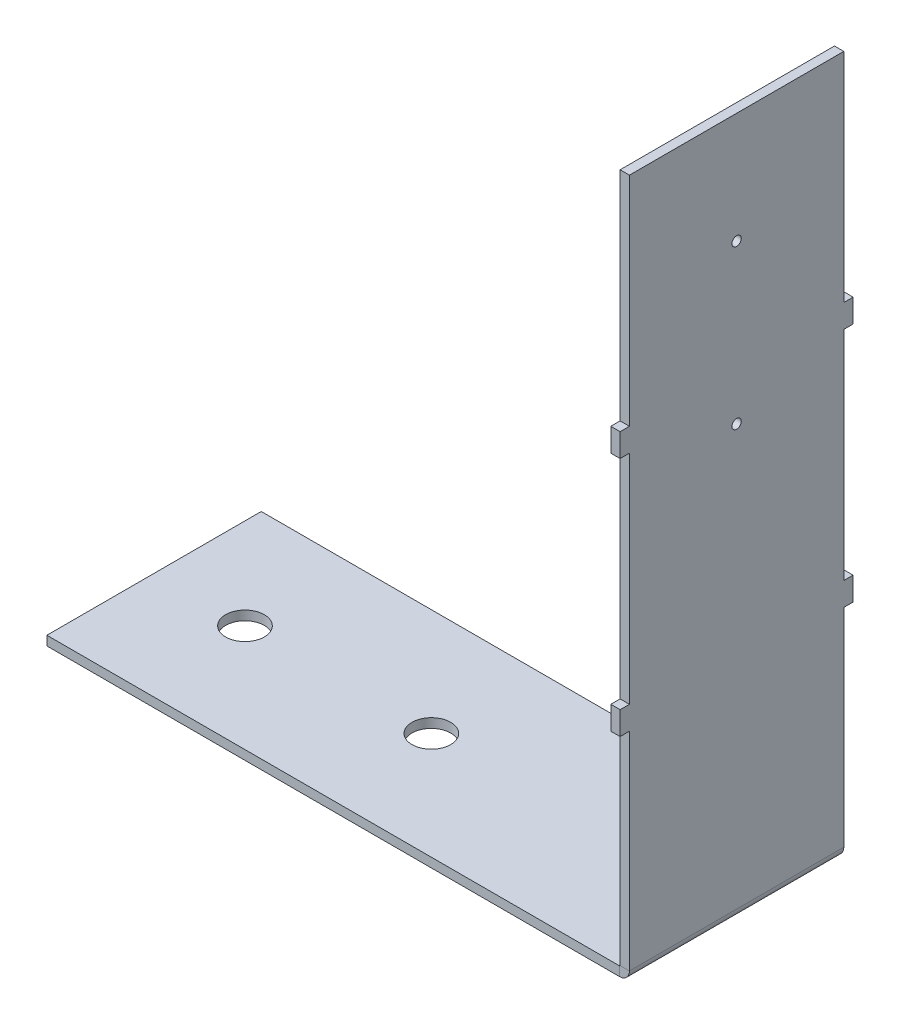
ISO-10303-21;
HEADER;
FILE_DESCRIPTION(('STEP AP214'),'2;1');
FILE_NAME('part.step','',(''),(''),'','','');
FILE_SCHEMA(('AUTOMOTIVE_DESIGN { 1 0 10303 214 1 1 1 1 }'));
ENDSEC;
DATA;
#1=APPLICATION_CONTEXT('core data for automotive mechanical design processes');
#2=APPLICATION_PROTOCOL_DEFINITION('international standard','automotive_design',2000,#1);
#3=PRODUCT_CONTEXT('',#1,'mechanical');
#4=PRODUCT('Part','Part','',(#3));
#5=PRODUCT_RELATED_PRODUCT_CATEGORY('part','',(#4));
#6=PRODUCT_DEFINITION_FORMATION('','',#4);
#7=PRODUCT_DEFINITION_CONTEXT('part definition',#1,'design');
#8=PRODUCT_DEFINITION('design','',#6,#7);
#9=PRODUCT_DEFINITION_SHAPE('','',#8);
#10=(LENGTH_UNIT() NAMED_UNIT(*) SI_UNIT(.MILLI.,.METRE.));
#11=(NAMED_UNIT(*) PLANE_ANGLE_UNIT() SI_UNIT($,.RADIAN.));
#12=(NAMED_UNIT(*) SI_UNIT($,.STERADIAN.) SOLID_ANGLE_UNIT());
#13=UNCERTAINTY_MEASURE_WITH_UNIT(LENGTH_MEASURE(1.E-05),#10,'distance_accuracy_value','');
#14=(GEOMETRIC_REPRESENTATION_CONTEXT(3) GLOBAL_UNCERTAINTY_ASSIGNED_CONTEXT((#13)) GLOBAL_UNIT_ASSIGNED_CONTEXT((#10,
#11,#12)) REPRESENTATION_CONTEXT('',''));
#15=CARTESIAN_POINT('',(0.,0.,0.));
#16=DIRECTION('',(0.,0.,1.));
#17=DIRECTION('',(1.,0.,0.));
#18=AXIS2_PLACEMENT_3D('',#15,#16,#17);
#19=CARTESIAN_POINT('',(642.5,94.9999999999999,145.));
#20=DIRECTION('',(0.,-1.,0.));
#21=DIRECTION('',(0.,0.,-1.));
#22=AXIS2_PLACEMENT_3D('',#19,#20,#21);
#23=CYLINDRICAL_SURFACE('',#22,4.15);
#24=CARTESIAN_POINT('',(642.5,94.9999999999999,145.));
#25=DIRECTION('',(0.,-1.,0.));
#26=DIRECTION('',(1.,0.,0.));
#27=AXIS2_PLACEMENT_3D('',#24,#25,#26);
#28=CIRCLE('',#27,4.15);
#29=CARTESIAN_POINT('',(646.65,94.9999999999999,145.));
#30=VERTEX_POINT('',#29);
#31=EDGE_CURVE('E253',#30,#30,#28,.T.);
#32=ORIENTED_EDGE('',*,*,#31,.T.);
#33=EDGE_LOOP('',(#32));
#34=FACE_BOUND('',#33,.T.);
#35=CARTESIAN_POINT('',(642.5,96.9999999999999,145.));
#36=DIRECTION('',(0.,1.,0.));
#37=DIRECTION('',(-1.,0.,0.));
#38=AXIS2_PLACEMENT_3D('',#35,#36,#37);
#39=CIRCLE('',#38,4.15);
#40=CARTESIAN_POINT('',(638.35,96.9999999999999,145.));
#41=VERTEX_POINT('',#40);
#42=EDGE_CURVE('E56',#41,#41,#39,.F.);
#43=ORIENTED_EDGE('',*,*,#42,.F.);
#44=EDGE_LOOP('',(#43));
#45=FACE_BOUND('',#44,.T.);
#46=ADVANCED_FACE('F45',(#34,#45),#23,.F.);
#47=CARTESIAN_POINT('',(682.5,94.9999999999999,145.));
#48=DIRECTION('',(0.,-1.,0.));
#49=DIRECTION('',(0.,0.,-1.));
#50=AXIS2_PLACEMENT_3D('',#47,#48,#49);
#51=CYLINDRICAL_SURFACE('',#50,4.15);
#52=CARTESIAN_POINT('',(682.5,94.9999999999999,145.));
#53=DIRECTION('',(0.,-1.,0.));
#54=DIRECTION('',(1.,0.,0.));
#55=AXIS2_PLACEMENT_3D('',#52,#53,#54);
#56=CIRCLE('',#55,4.15);
#57=CARTESIAN_POINT('',(686.65,94.9999999999999,145.));
#58=VERTEX_POINT('',#57);
#59=EDGE_CURVE('E515',#58,#58,#56,.T.);
#60=ORIENTED_EDGE('',*,*,#59,.T.);
#61=EDGE_LOOP('',(#60));
#62=FACE_BOUND('',#61,.T.);
#63=CARTESIAN_POINT('',(682.5,96.9999999999999,145.));
#64=DIRECTION('',(0.,1.,0.));
#65=DIRECTION('',(-1.,0.,0.));
#66=AXIS2_PLACEMENT_3D('',#63,#64,#65);
#67=CIRCLE('',#66,4.15);
#68=CARTESIAN_POINT('',(678.35,96.9999999999999,145.));
#69=VERTEX_POINT('',#68);
#70=EDGE_CURVE('E12',#69,#69,#67,.F.);
#71=ORIENTED_EDGE('',*,*,#70,.F.);
#72=EDGE_LOOP('',(#71));
#73=FACE_BOUND('',#72,.T.);
#74=ADVANCED_FACE('F474',(#62,#73),#51,.F.);
#75=CARTESIAN_POINT('',(623.,357.453119623296,120.));
#76=DIRECTION('',(1.,0.,0.));
#77=DIRECTION('',(0.,1.,0.));
#78=AXIS2_PLACEMENT_3D('',#75,#76,#77);
#79=PLANE('',#78);
#80=DIRECTION('',(0.,0.,1.));
#81=VECTOR('',#80,1.);
#82=CARTESIAN_POINT('',(623.,94.9999999999999,120.));
#83=LINE('',#82,#81);
#84=CARTESIAN_POINT('',(623.,95.,122.));
#85=VERTEX_POINT('',#84);
#86=CARTESIAN_POINT('',(623.,94.9999999999999,168.));
#87=VERTEX_POINT('',#86);
#88=EDGE_CURVE('E232',#85,#87,#83,.T.);
#89=ORIENTED_EDGE('',*,*,#88,.T.);
#90=DIRECTION('',(0.,-1.,0.));
#91=VECTOR('',#90,1.);
#92=CARTESIAN_POINT('',(623.,357.453119623296,168.));
#93=LINE('',#92,#91);
#94=CARTESIAN_POINT('',(623.,96.9999999999999,168.));
#95=VERTEX_POINT('',#94);
#96=EDGE_CURVE('E502',#95,#87,#93,.T.);
#97=ORIENTED_EDGE('',*,*,#96,.F.);
#98=DIRECTION('',(0.,0.,1.));
#99=VECTOR('',#98,1.);
#100=CARTESIAN_POINT('',(623.,96.9999999999999,120.));
#101=LINE('',#100,#99);
#102=CARTESIAN_POINT('',(623.,97.,122.));
#103=VERTEX_POINT('',#102);
#104=EDGE_CURVE('E91',#103,#95,#101,.T.);
#105=ORIENTED_EDGE('',*,*,#104,.F.);
#106=DIRECTION('',(0.,-1.,0.));
#107=VECTOR('',#106,1.);
#108=CARTESIAN_POINT('',(623.,357.453119623296,122.));
#109=LINE('',#108,#107);
#110=EDGE_CURVE('E243',#103,#85,#109,.T.);
#111=ORIENTED_EDGE('',*,*,#110,.T.);
#112=EDGE_LOOP('',(#89,#97,#105,#111));
#113=FACE_BOUND('',#112,.T.);
#114=ADVANCED_FACE('F480',(#113),#79,.F.);
#115=CARTESIAN_POINT('',(748.,357.453119623296,122.));
#116=DIRECTION('',(0.,0.,-1.));
#117=DIRECTION('',(0.,1.,0.));
#118=AXIS2_PLACEMENT_3D('',#115,#116,#117);
#119=PLANE('',#118);
#120=DIRECTION('',(0.,-1.,0.));
#121=VECTOR('',#120,1.);
#122=CARTESIAN_POINT('',(745.9,357.453119623296,122.));
#123=LINE('',#122,#121);
#124=CARTESIAN_POINT('',(745.9,97.,122.));
#125=VERTEX_POINT('',#124);
#126=CARTESIAN_POINT('',(745.9,95.,122.));
#127=VERTEX_POINT('',#126);
#128=EDGE_CURVE('E234',#125,#127,#123,.T.);
#129=ORIENTED_EDGE('',*,*,#128,.T.);
#130=DIRECTION('',(-1.,0.,0.));
#131=VECTOR('',#130,1.);
#132=CARTESIAN_POINT('',(748.,95.,122.));
#133=LINE('',#132,#131);
#134=EDGE_CURVE('E86',#127,#85,#133,.T.);
#135=ORIENTED_EDGE('',*,*,#134,.T.);
#136=ORIENTED_EDGE('',*,*,#110,.F.);
#137=DIRECTION('',(1.,0.,0.));
#138=VECTOR('',#137,1.);
#139=CARTESIAN_POINT('',(748.,97.,122.));
#140=LINE('',#139,#138);
#141=EDGE_CURVE('E233',#103,#125,#140,.T.);
#142=ORIENTED_EDGE('',*,*,#141,.T.);
#143=EDGE_LOOP('',(#129,#135,#136,#142));
#144=FACE_BOUND('',#143,.T.);
#145=ADVANCED_FACE('F237',(#144),#119,.T.);
#146=CARTESIAN_POINT('',(748.,95.,120.));
#147=DIRECTION('',(0.,-1.,0.));
#148=DIRECTION('',(1.,0.,0.));
#149=AXIS2_PLACEMENT_3D('',#146,#147,#148);
#150=PLANE('',#149);
#151=DIRECTION('',(0.,0.,-1.));
#152=VECTOR('',#151,1.);
#153=CARTESIAN_POINT('',(745.9,95.,122.));
#154=LINE('',#153,#152);
#155=CARTESIAN_POINT('',(745.9,95.,168.));
#156=VERTEX_POINT('',#155);
#157=EDGE_CURVE('E229',#156,#127,#154,.T.);
#158=ORIENTED_EDGE('',*,*,#157,.F.);
#159=DIRECTION('',(1.,0.,0.));
#160=VECTOR('',#159,1.);
#161=CARTESIAN_POINT('',(748.,95.,168.));
#162=LINE('',#161,#160);
#163=EDGE_CURVE('E500',#87,#156,#162,.T.);
#164=ORIENTED_EDGE('',*,*,#163,.F.);
#165=ORIENTED_EDGE('',*,*,#88,.F.);
#166=ORIENTED_EDGE('',*,*,#134,.F.);
#167=EDGE_LOOP('',(#158,#164,#165,#166));
#168=FACE_BOUND('',#167,.T.);
#169=ORIENTED_EDGE('',*,*,#59,.F.);
#170=EDGE_LOOP('',(#169));
#171=FACE_BOUND('',#170,.T.);
#172=ORIENTED_EDGE('',*,*,#31,.F.);
#173=EDGE_LOOP('',(#172));
#174=FACE_BOUND('',#173,.T.);
#175=ADVANCED_FACE('F225',(#168,#171,#174),#150,.T.);
#176=CARTESIAN_POINT('',(748.,357.453119623296,168.));
#177=DIRECTION('',(0.,0.,-1.));
#178=DIRECTION('',(0.,1.,0.));
#179=AXIS2_PLACEMENT_3D('',#176,#177,#178);
#180=PLANE('',#179);
#181=ORIENTED_EDGE('',*,*,#163,.T.);
#182=DIRECTION('',(0.,-1.,0.));
#183=VECTOR('',#182,1.);
#184=CARTESIAN_POINT('',(745.9,357.453119623296,168.));
#185=LINE('',#184,#183);
#186=CARTESIAN_POINT('',(745.9,97.,168.));
#187=VERTEX_POINT('',#186);
#188=EDGE_CURVE('E254',#187,#156,#185,.T.);
#189=ORIENTED_EDGE('',*,*,#188,.F.);
#190=DIRECTION('',(1.,0.,0.));
#191=VECTOR('',#190,1.);
#192=CARTESIAN_POINT('',(748.,97.,168.));
#193=LINE('',#192,#191);
#194=EDGE_CURVE('E65',#95,#187,#193,.T.);
#195=ORIENTED_EDGE('',*,*,#194,.F.);
#196=ORIENTED_EDGE('',*,*,#96,.T.);
#197=EDGE_LOOP('',(#181,#189,#195,#196));
#198=FACE_BOUND('',#197,.T.);
#199=ADVANCED_FACE('F494',(#198),#180,.F.);
#200=CARTESIAN_POINT('',(746.,97.,168.));
#201=DIRECTION('',(0.,1.,0.));
#202=DIRECTION('',(-1.,0.,0.));
#203=AXIS2_PLACEMENT_3D('',#200,#201,#202);
#204=PLANE('',#203);
#205=DIRECTION('',(0.,0.,1.));
#206=VECTOR('',#205,1.);
#207=CARTESIAN_POINT('',(745.9,97.,122.));
#208=LINE('',#207,#206);
#209=EDGE_CURVE('E49',#125,#187,#208,.T.);
#210=ORIENTED_EDGE('',*,*,#209,.F.);
#211=ORIENTED_EDGE('',*,*,#141,.F.);
#212=ORIENTED_EDGE('',*,*,#104,.T.);
#213=ORIENTED_EDGE('',*,*,#194,.T.);
#214=EDGE_LOOP('',(#210,#211,#212,#213));
#215=FACE_BOUND('',#214,.T.);
#216=ORIENTED_EDGE('',*,*,#42,.T.);
#217=EDGE_LOOP('',(#216));
#218=FACE_BOUND('',#217,.T.);
#219=ORIENTED_EDGE('',*,*,#70,.T.);
#220=EDGE_LOOP('',(#219));
#221=FACE_BOUND('',#220,.T.);
#222=ADVANCED_FACE('F47',(#215,#218,#221),#204,.T.);
#223=CARTESIAN_POINT('',(748.,245.,120.));
#224=DIRECTION('',(1.,0.,0.));
#225=DIRECTION('',(0.,1.,0.));
#226=AXIS2_PLACEMENT_3D('',#223,#224,#225);
#227=PLANE('',#226);
#228=CARTESIAN_POINT('',(748.,221.249998746621,145.));
#229=DIRECTION('',(1.,0.,0.));
#230=DIRECTION('',(0.,1.,0.));
#231=AXIS2_PLACEMENT_3D('',#228,#229,#230);
#232=CIRCLE('',#231,0.999999999999998);
#233=CARTESIAN_POINT('',(748.,222.249998746621,145.));
#234=VERTEX_POINT('',#233);
#235=EDGE_CURVE('E358',#234,#234,#232,.T.);
#236=ORIENTED_EDGE('',*,*,#235,.F.);
#237=EDGE_LOOP('',(#236));
#238=FACE_BOUND('',#237,.T.);
#239=CARTESIAN_POINT('',(748.,187.282181110447,145.));
#240=DIRECTION('',(1.,0.,0.));
#241=DIRECTION('',(0.,1.,0.));
#242=AXIS2_PLACEMENT_3D('',#239,#240,#241);
#243=CIRCLE('',#242,0.999999999999998);
#244=CARTESIAN_POINT('',(748.,188.282181110447,145.));
#245=VERTEX_POINT('',#244);
#246=EDGE_CURVE('E362',#245,#245,#243,.T.);
#247=ORIENTED_EDGE('',*,*,#246,.F.);
#248=EDGE_LOOP('',(#247));
#249=FACE_BOUND('',#248,.T.);
#250=DIRECTION('',(0.,1.,0.));
#251=VECTOR('',#250,1.);
#252=CARTESIAN_POINT('',(748.,245.,168.));
#253=LINE('',#252,#251);
#254=CARTESIAN_POINT('',(748.,97.0999999999997,168.));
#255=VERTEX_POINT('',#254);
#256=CARTESIAN_POINT('',(748.,141.666666666667,168.));
#257=VERTEX_POINT('',#256);
#258=EDGE_CURVE('E530',#255,#257,#253,.T.);
#259=ORIENTED_EDGE('',*,*,#258,.F.);
#260=DIRECTION('',(0.,0.,-1.));
#261=VECTOR('',#260,1.);
#262=CARTESIAN_POINT('',(748.,97.0999999999999,122.));
#263=LINE('',#262,#261);
#264=CARTESIAN_POINT('',(748.,97.0999999999999,122.));
#265=VERTEX_POINT('',#264);
#266=EDGE_CURVE('E281',#255,#265,#263,.T.);
#267=ORIENTED_EDGE('',*,*,#266,.T.);
#268=DIRECTION('',(0.,-1.,0.));
#269=VECTOR('',#268,1.);
#270=CARTESIAN_POINT('',(748.,245.,122.));
#271=LINE('',#270,#269);
#272=CARTESIAN_POINT('',(748.,141.666666666667,122.));
#273=VERTEX_POINT('',#272);
#274=EDGE_CURVE('E376',#273,#265,#271,.T.);
#275=ORIENTED_EDGE('',*,*,#274,.F.);
#276=DIRECTION('',(0.,0.,-1.));
#277=VECTOR('',#276,1.);
#278=CARTESIAN_POINT('',(748.,141.666666666667,122.));
#279=LINE('',#278,#277);
#280=CARTESIAN_POINT('',(748.,141.666666666667,120.));
#281=VERTEX_POINT('',#280);
#282=EDGE_CURVE('E627',#273,#281,#279,.T.);
#283=ORIENTED_EDGE('',*,*,#282,.T.);
#284=DIRECTION('',(0.,1.,0.));
#285=VECTOR('',#284,1.);
#286=CARTESIAN_POINT('',(748.,141.666666666667,120.));
#287=LINE('',#286,#285);
#288=CARTESIAN_POINT('',(748.,146.666666666667,120.));
#289=VERTEX_POINT('',#288);
#290=EDGE_CURVE('E629',#281,#289,#287,.T.);
#291=ORIENTED_EDGE('',*,*,#290,.T.);
#292=DIRECTION('',(0.,0.,1.));
#293=VECTOR('',#292,1.);
#294=CARTESIAN_POINT('',(748.,146.666666666667,122.));
#295=LINE('',#294,#293);
#296=CARTESIAN_POINT('',(748.,146.666666666667,122.));
#297=VERTEX_POINT('',#296);
#298=EDGE_CURVE('E395',#289,#297,#295,.T.);
#299=ORIENTED_EDGE('',*,*,#298,.T.);
#300=CARTESIAN_POINT('',(748.,193.333333333333,122.));
#301=VERTEX_POINT('',#300);
#302=EDGE_CURVE('E375',#301,#297,#271,.T.);
#303=ORIENTED_EDGE('',*,*,#302,.F.);
#304=DIRECTION('',(0.,0.,-1.));
#305=VECTOR('',#304,1.);
#306=CARTESIAN_POINT('',(748.,193.333333333333,122.));
#307=LINE('',#306,#305);
#308=CARTESIAN_POINT('',(748.,193.333333333333,120.));
#309=VERTEX_POINT('',#308);
#310=EDGE_CURVE('E392',#301,#309,#307,.T.);
#311=ORIENTED_EDGE('',*,*,#310,.T.);
#312=DIRECTION('',(0.,1.,0.));
#313=VECTOR('',#312,1.);
#314=CARTESIAN_POINT('',(748.,193.333333333333,120.));
#315=LINE('',#314,#313);
#316=CARTESIAN_POINT('',(748.,198.333333333333,120.));
#317=VERTEX_POINT('',#316);
#318=EDGE_CURVE('E394',#309,#317,#315,.T.);
#319=ORIENTED_EDGE('',*,*,#318,.T.);
#320=DIRECTION('',(0.,0.,1.));
#321=VECTOR('',#320,1.);
#322=CARTESIAN_POINT('',(748.,198.333333333333,122.));
#323=LINE('',#322,#321);
#324=CARTESIAN_POINT('',(748.,198.333333333333,122.));
#325=VERTEX_POINT('',#324);
#326=EDGE_CURVE('E282',#317,#325,#323,.T.);
#327=ORIENTED_EDGE('',*,*,#326,.T.);
#328=CARTESIAN_POINT('',(748.,245.,122.));
#329=VERTEX_POINT('',#328);
#330=EDGE_CURVE('E370',#329,#325,#271,.T.);
#331=ORIENTED_EDGE('',*,*,#330,.F.);
#332=DIRECTION('',(0.,0.,1.));
#333=VECTOR('',#332,1.);
#334=CARTESIAN_POINT('',(748.,245.,120.));
#335=LINE('',#334,#333);
#336=CARTESIAN_POINT('',(748.,245.,168.));
#337=VERTEX_POINT('',#336);
#338=EDGE_CURVE('E374',#329,#337,#335,.T.);
#339=ORIENTED_EDGE('',*,*,#338,.T.);
#340=CARTESIAN_POINT('',(748.,198.333333333333,168.));
#341=VERTEX_POINT('',#340);
#342=EDGE_CURVE('E533',#341,#337,#253,.T.);
#343=ORIENTED_EDGE('',*,*,#342,.F.);
#344=DIRECTION('',(0.,0.,1.));
#345=VECTOR('',#344,1.);
#346=CARTESIAN_POINT('',(748.,198.333333333333,168.));
#347=LINE('',#346,#345);
#348=CARTESIAN_POINT('',(748.,198.333333333333,170.));
#349=VERTEX_POINT('',#348);
#350=EDGE_CURVE('E599',#341,#349,#347,.T.);
#351=ORIENTED_EDGE('',*,*,#350,.T.);
#352=DIRECTION('',(0.,-1.,0.));
#353=VECTOR('',#352,1.);
#354=CARTESIAN_POINT('',(748.,198.333333333333,170.));
#355=LINE('',#354,#353);
#356=CARTESIAN_POINT('',(748.,193.333333333333,170.));
#357=VERTEX_POINT('',#356);
#358=EDGE_CURVE('E601',#349,#357,#355,.T.);
#359=ORIENTED_EDGE('',*,*,#358,.T.);
#360=DIRECTION('',(0.,0.,-1.));
#361=VECTOR('',#360,1.);
#362=CARTESIAN_POINT('',(748.,193.333333333333,168.));
#363=LINE('',#362,#361);
#364=CARTESIAN_POINT('',(748.,193.333333333333,168.));
#365=VERTEX_POINT('',#364);
#366=EDGE_CURVE('E603',#357,#365,#363,.T.);
#367=ORIENTED_EDGE('',*,*,#366,.T.);
#368=CARTESIAN_POINT('',(748.,146.666666666667,168.));
#369=VERTEX_POINT('',#368);
#370=EDGE_CURVE('E532',#369,#365,#253,.T.);
#371=ORIENTED_EDGE('',*,*,#370,.F.);
#372=DIRECTION('',(0.,0.,1.));
#373=VECTOR('',#372,1.);
#374=CARTESIAN_POINT('',(748.,146.666666666667,168.));
#375=LINE('',#374,#373);
#376=CARTESIAN_POINT('',(748.,146.666666666667,170.));
#377=VERTEX_POINT('',#376);
#378=EDGE_CURVE('E618',#369,#377,#375,.T.);
#379=ORIENTED_EDGE('',*,*,#378,.T.);
#380=DIRECTION('',(0.,-1.,0.));
#381=VECTOR('',#380,1.);
#382=CARTESIAN_POINT('',(748.,146.666666666667,170.));
#383=LINE('',#382,#381);
#384=CARTESIAN_POINT('',(748.,141.666666666667,170.));
#385=VERTEX_POINT('',#384);
#386=EDGE_CURVE('E535',#377,#385,#383,.T.);
#387=ORIENTED_EDGE('',*,*,#386,.T.);
#388=DIRECTION('',(0.,0.,-1.));
#389=VECTOR('',#388,1.);
#390=CARTESIAN_POINT('',(748.,141.666666666667,168.));
#391=LINE('',#390,#389);
#392=EDGE_CURVE('E531',#385,#257,#391,.T.);
#393=ORIENTED_EDGE('',*,*,#392,.T.);
#394=EDGE_LOOP('',(#259,#267,#275,#283,#291,#299,#303,#311,#319,#327,#331,#339,#343,#351,#359,
#367,#371,#379,#387,#393));
#395=FACE_BOUND('',#394,.T.);
#396=ADVANCED_FACE('F402',(#238,#249,#395),#227,.T.);
#397=CARTESIAN_POINT('',(746.,245.,120.));
#398=DIRECTION('',(1.,0.,0.));
#399=DIRECTION('',(0.,1.,0.));
#400=AXIS2_PLACEMENT_3D('',#397,#398,#399);
#401=PLANE('',#400);
#402=CARTESIAN_POINT('',(746.,187.282181110447,145.));
#403=DIRECTION('',(-1.,0.,0.));
#404=DIRECTION('',(0.,-1.,0.));
#405=AXIS2_PLACEMENT_3D('',#402,#403,#404);
#406=CIRCLE('',#405,0.999999999999998);
#407=CARTESIAN_POINT('',(746.,186.282181110447,145.));
#408=VERTEX_POINT('',#407);
#409=EDGE_CURVE('E563',#408,#408,#406,.T.);
#410=ORIENTED_EDGE('',*,*,#409,.F.);
#411=EDGE_LOOP('',(#410));
#412=FACE_BOUND('',#411,.T.);
#413=CARTESIAN_POINT('',(746.,221.249998746621,145.));
#414=DIRECTION('',(-1.,0.,0.));
#415=DIRECTION('',(0.,-1.,0.));
#416=AXIS2_PLACEMENT_3D('',#413,#414,#415);
#417=CIRCLE('',#416,0.999999999999998);
#418=CARTESIAN_POINT('',(746.,220.249998746621,145.));
#419=VERTEX_POINT('',#418);
#420=EDGE_CURVE('E262',#419,#419,#417,.T.);
#421=ORIENTED_EDGE('',*,*,#420,.F.);
#422=EDGE_LOOP('',(#421));
#423=FACE_BOUND('',#422,.T.);
#424=DIRECTION('',(0.,0.,-1.));
#425=VECTOR('',#424,1.);
#426=CARTESIAN_POINT('',(746.,97.0999999999999,122.));
#427=LINE('',#426,#425);
#428=CARTESIAN_POINT('',(746.,97.0999999999999,168.));
#429=VERTEX_POINT('',#428);
#430=CARTESIAN_POINT('',(746.,97.1,122.));
#431=VERTEX_POINT('',#430);
#432=EDGE_CURVE('E276',#429,#431,#427,.T.);
#433=ORIENTED_EDGE('',*,*,#432,.F.);
#434=DIRECTION('',(0.,1.,0.));
#435=VECTOR('',#434,1.);
#436=CARTESIAN_POINT('',(746.,245.,168.));
#437=LINE('',#436,#435);
#438=CARTESIAN_POINT('',(746.,141.666666666667,168.));
#439=VERTEX_POINT('',#438);
#440=EDGE_CURVE('E98',#429,#439,#437,.T.);
#441=ORIENTED_EDGE('',*,*,#440,.T.);
#442=DIRECTION('',(0.,0.,-1.));
#443=VECTOR('',#442,1.);
#444=CARTESIAN_POINT('',(746.,141.666666666667,168.));
#445=LINE('',#444,#443);
#446=CARTESIAN_POINT('',(746.,141.666666666667,170.));
#447=VERTEX_POINT('',#446);
#448=EDGE_CURVE('E106',#447,#439,#445,.T.);
#449=ORIENTED_EDGE('',*,*,#448,.F.);
#450=DIRECTION('',(0.,-1.,0.));
#451=VECTOR('',#450,1.);
#452=CARTESIAN_POINT('',(746.,146.666666666667,170.));
#453=LINE('',#452,#451);
#454=CARTESIAN_POINT('',(746.,146.666666666667,170.));
#455=VERTEX_POINT('',#454);
#456=EDGE_CURVE('E542',#455,#447,#453,.T.);
#457=ORIENTED_EDGE('',*,*,#456,.F.);
#458=DIRECTION('',(0.,0.,1.));
#459=VECTOR('',#458,1.);
#460=CARTESIAN_POINT('',(746.,146.666666666667,168.));
#461=LINE('',#460,#459);
#462=CARTESIAN_POINT('',(746.,146.666666666667,168.));
#463=VERTEX_POINT('',#462);
#464=EDGE_CURVE('E544',#463,#455,#461,.T.);
#465=ORIENTED_EDGE('',*,*,#464,.F.);
#466=CARTESIAN_POINT('',(746.,193.333333333333,168.));
#467=VERTEX_POINT('',#466);
#468=EDGE_CURVE('E546',#463,#467,#437,.T.);
#469=ORIENTED_EDGE('',*,*,#468,.T.);
#470=DIRECTION('',(0.,0.,-1.));
#471=VECTOR('',#470,1.);
#472=CARTESIAN_POINT('',(746.,193.333333333333,168.));
#473=LINE('',#472,#471);
#474=CARTESIAN_POINT('',(746.,193.333333333333,170.));
#475=VERTEX_POINT('',#474);
#476=EDGE_CURVE('E579',#475,#467,#473,.T.);
#477=ORIENTED_EDGE('',*,*,#476,.F.);
#478=DIRECTION('',(0.,-1.,0.));
#479=VECTOR('',#478,1.);
#480=CARTESIAN_POINT('',(746.,198.333333333333,170.));
#481=LINE('',#480,#479);
#482=CARTESIAN_POINT('',(746.,198.333333333333,170.));
#483=VERTEX_POINT('',#482);
#484=EDGE_CURVE('E577',#483,#475,#481,.T.);
#485=ORIENTED_EDGE('',*,*,#484,.F.);
#486=DIRECTION('',(0.,0.,1.));
#487=VECTOR('',#486,1.);
#488=CARTESIAN_POINT('',(746.,198.333333333333,168.));
#489=LINE('',#488,#487);
#490=CARTESIAN_POINT('',(746.,198.333333333333,168.));
#491=VERTEX_POINT('',#490);
#492=EDGE_CURVE('E574',#491,#483,#489,.T.);
#493=ORIENTED_EDGE('',*,*,#492,.F.);
#494=CARTESIAN_POINT('',(746.,245.,168.));
#495=VERTEX_POINT('',#494);
#496=EDGE_CURVE('E564',#491,#495,#437,.T.);
#497=ORIENTED_EDGE('',*,*,#496,.T.);
#498=DIRECTION('',(0.,0.,1.));
#499=VECTOR('',#498,1.);
#500=CARTESIAN_POINT('',(746.,245.,120.));
#501=LINE('',#500,#499);
#502=CARTESIAN_POINT('',(746.,245.,122.));
#503=VERTEX_POINT('',#502);
#504=EDGE_CURVE('E421',#503,#495,#501,.T.);
#505=ORIENTED_EDGE('',*,*,#504,.F.);
#506=DIRECTION('',(0.,1.,0.));
#507=VECTOR('',#506,1.);
#508=CARTESIAN_POINT('',(746.,245.,122.));
#509=LINE('',#508,#507);
#510=CARTESIAN_POINT('',(746.,198.333333333333,122.));
#511=VERTEX_POINT('',#510);
#512=EDGE_CURVE('E417',#511,#503,#509,.T.);
#513=ORIENTED_EDGE('',*,*,#512,.F.);
#514=DIRECTION('',(0.,0.,1.));
#515=VECTOR('',#514,1.);
#516=CARTESIAN_POINT('',(746.,198.333333333333,122.));
#517=LINE('',#516,#515);
#518=CARTESIAN_POINT('',(746.,198.333333333333,120.));
#519=VERTEX_POINT('',#518);
#520=EDGE_CURVE('E413',#519,#511,#517,.T.);
#521=ORIENTED_EDGE('',*,*,#520,.F.);
#522=DIRECTION('',(0.,1.,0.));
#523=VECTOR('',#522,1.);
#524=CARTESIAN_POINT('',(746.,193.333333333333,120.));
#525=LINE('',#524,#523);
#526=CARTESIAN_POINT('',(746.,193.333333333333,120.));
#527=VERTEX_POINT('',#526);
#528=EDGE_CURVE('E416',#527,#519,#525,.T.);
#529=ORIENTED_EDGE('',*,*,#528,.F.);
#530=DIRECTION('',(0.,0.,-1.));
#531=VECTOR('',#530,1.);
#532=CARTESIAN_POINT('',(746.,193.333333333333,122.));
#533=LINE('',#532,#531);
#534=CARTESIAN_POINT('',(746.,193.333333333333,122.));
#535=VERTEX_POINT('',#534);
#536=EDGE_CURVE('E419',#535,#527,#533,.T.);
#537=ORIENTED_EDGE('',*,*,#536,.F.);
#538=CARTESIAN_POINT('',(746.,146.666666666667,122.));
#539=VERTEX_POINT('',#538);
#540=EDGE_CURVE('E422',#539,#535,#509,.T.);
#541=ORIENTED_EDGE('',*,*,#540,.F.);
#542=DIRECTION('',(0.,0.,1.));
#543=VECTOR('',#542,1.);
#544=CARTESIAN_POINT('',(746.,146.666666666667,122.));
#545=LINE('',#544,#543);
#546=CARTESIAN_POINT('',(746.,146.666666666667,120.));
#547=VERTEX_POINT('',#546);
#548=EDGE_CURVE('E437',#547,#539,#545,.T.);
#549=ORIENTED_EDGE('',*,*,#548,.F.);
#550=DIRECTION('',(0.,1.,0.));
#551=VECTOR('',#550,1.);
#552=CARTESIAN_POINT('',(746.,141.666666666667,120.));
#553=LINE('',#552,#551);
#554=CARTESIAN_POINT('',(746.,141.666666666667,120.));
#555=VERTEX_POINT('',#554);
#556=EDGE_CURVE('E439',#555,#547,#553,.T.);
#557=ORIENTED_EDGE('',*,*,#556,.F.);
#558=DIRECTION('',(0.,0.,-1.));
#559=VECTOR('',#558,1.);
#560=CARTESIAN_POINT('',(746.,141.666666666667,122.));
#561=LINE('',#560,#559);
#562=CARTESIAN_POINT('',(746.,141.666666666667,122.));
#563=VERTEX_POINT('',#562);
#564=EDGE_CURVE('E364',#563,#555,#561,.T.);
#565=ORIENTED_EDGE('',*,*,#564,.F.);
#566=EDGE_CURVE('E363',#431,#563,#509,.T.);
#567=ORIENTED_EDGE('',*,*,#566,.F.);
#568=EDGE_LOOP('',(#433,#441,#449,#457,#465,#469,#477,#485,#493,#497,#505,#513,#521,#529,#537,
#541,#549,#557,#565,#567));
#569=FACE_BOUND('',#568,.T.);
#570=ADVANCED_FACE('F462',(#412,#423,#569),#401,.F.);
#571=CARTESIAN_POINT('',(756.,187.282181110447,145.));
#572=DIRECTION('',(-1.,0.,0.));
#573=DIRECTION('',(0.,-1.,0.));
#574=AXIS2_PLACEMENT_3D('',#571,#572,#573);
#575=CYLINDRICAL_SURFACE('',#574,0.999999999999998);
#576=ORIENTED_EDGE('',*,*,#246,.T.);
#577=EDGE_LOOP('',(#576));
#578=FACE_BOUND('',#577,.T.);
#579=ORIENTED_EDGE('',*,*,#409,.T.);
#580=EDGE_LOOP('',(#579));
#581=FACE_BOUND('',#580,.T.);
#582=ADVANCED_FACE('F656',(#578,#581),#575,.F.);
#583=CARTESIAN_POINT('',(756.,221.249998746621,145.));
#584=DIRECTION('',(-1.,0.,0.));
#585=DIRECTION('',(0.,-1.,0.));
#586=AXIS2_PLACEMENT_3D('',#583,#584,#585);
#587=CYLINDRICAL_SURFACE('',#586,0.999999999999998);
#588=ORIENTED_EDGE('',*,*,#235,.T.);
#589=EDGE_LOOP('',(#588));
#590=FACE_BOUND('',#589,.T.);
#591=ORIENTED_EDGE('',*,*,#420,.T.);
#592=EDGE_LOOP('',(#591));
#593=FACE_BOUND('',#592,.T.);
#594=ADVANCED_FACE('F649',(#590,#593),#587,.F.);
#595=CARTESIAN_POINT('',(435.753879127378,245.,122.));
#596=DIRECTION('',(0.,0.,-1.));
#597=DIRECTION('',(-1.,0.,0.));
#598=AXIS2_PLACEMENT_3D('',#595,#596,#597);
#599=PLANE('',#598);
#600=DIRECTION('',(1.,0.,0.));
#601=VECTOR('',#600,1.);
#602=CARTESIAN_POINT('',(435.753879127378,141.666666666667,122.));
#603=LINE('',#602,#601);
#604=EDGE_CURVE('E288',#563,#273,#603,.T.);
#605=ORIENTED_EDGE('',*,*,#604,.T.);
#606=ORIENTED_EDGE('',*,*,#274,.T.);
#607=DIRECTION('',(1.,0.,0.));
#608=VECTOR('',#607,1.);
#609=CARTESIAN_POINT('',(435.753879127378,97.1000000000002,122.));
#610=LINE('',#609,#608);
#611=EDGE_CURVE('E259',#431,#265,#610,.T.);
#612=ORIENTED_EDGE('',*,*,#611,.F.);
#613=ORIENTED_EDGE('',*,*,#566,.T.);
#614=EDGE_LOOP('',(#605,#606,#612,#613));
#615=FACE_BOUND('',#614,.T.);
#616=ADVANCED_FACE('F633',(#615),#599,.T.);
#617=CARTESIAN_POINT('',(435.753879127378,245.,168.));
#618=DIRECTION('',(0.,0.,-1.));
#619=DIRECTION('',(-1.,0.,0.));
#620=AXIS2_PLACEMENT_3D('',#617,#618,#619);
#621=PLANE('',#620);
#622=ORIENTED_EDGE('',*,*,#258,.T.);
#623=DIRECTION('',(1.,0.,0.));
#624=VECTOR('',#623,1.);
#625=CARTESIAN_POINT('',(435.753879127378,141.666666666667,168.));
#626=LINE('',#625,#624);
#627=EDGE_CURVE('E339',#439,#257,#626,.T.);
#628=ORIENTED_EDGE('',*,*,#627,.F.);
#629=ORIENTED_EDGE('',*,*,#440,.F.);
#630=DIRECTION('',(1.,0.,0.));
#631=VECTOR('',#630,1.);
#632=CARTESIAN_POINT('',(435.753879127378,97.1000000000002,168.));
#633=LINE('',#632,#631);
#634=EDGE_CURVE('E341',#429,#255,#633,.T.);
#635=ORIENTED_EDGE('',*,*,#634,.T.);
#636=EDGE_LOOP('',(#622,#628,#629,#635));
#637=FACE_BOUND('',#636,.T.);
#638=ADVANCED_FACE('F529',(#637),#621,.F.);
#639=CARTESIAN_POINT('',(435.753879127378,141.666666666667,168.));
#640=DIRECTION('',(0.,-1.,0.));
#641=DIRECTION('',(1.,0.,0.));
#642=AXIS2_PLACEMENT_3D('',#639,#640,#641);
#643=PLANE('',#642);
#644=ORIENTED_EDGE('',*,*,#627,.T.);
#645=ORIENTED_EDGE('',*,*,#392,.F.);
#646=DIRECTION('',(1.,0.,0.));
#647=VECTOR('',#646,1.);
#648=CARTESIAN_POINT('',(435.753879127378,141.666666666667,170.));
#649=LINE('',#648,#647);
#650=EDGE_CURVE('E336',#447,#385,#649,.T.);
#651=ORIENTED_EDGE('',*,*,#650,.F.);
#652=ORIENTED_EDGE('',*,*,#448,.T.);
#653=EDGE_LOOP('',(#644,#645,#651,#652));
#654=FACE_BOUND('',#653,.T.);
#655=ADVANCED_FACE('F486',(#654),#643,.T.);
#656=CARTESIAN_POINT('',(435.753879127378,146.666666666667,170.));
#657=DIRECTION('',(0.,0.,1.));
#658=DIRECTION('',(1.,0.,0.));
#659=AXIS2_PLACEMENT_3D('',#656,#657,#658);
#660=PLANE('',#659);
#661=ORIENTED_EDGE('',*,*,#650,.T.);
#662=ORIENTED_EDGE('',*,*,#386,.F.);
#663=DIRECTION('',(1.,0.,0.));
#664=VECTOR('',#663,1.);
#665=CARTESIAN_POINT('',(435.753879127378,146.666666666667,170.));
#666=LINE('',#665,#664);
#667=EDGE_CURVE('E333',#455,#377,#666,.T.);
#668=ORIENTED_EDGE('',*,*,#667,.F.);
#669=ORIENTED_EDGE('',*,*,#456,.T.);
#670=EDGE_LOOP('',(#661,#662,#668,#669));
#671=FACE_BOUND('',#670,.T.);
#672=ADVANCED_FACE('F539',(#671),#660,.T.);
#673=CARTESIAN_POINT('',(435.753879127378,146.666666666667,168.));
#674=DIRECTION('',(0.,1.,0.));
#675=DIRECTION('',(-1.,0.,0.));
#676=AXIS2_PLACEMENT_3D('',#673,#674,#675);
#677=PLANE('',#676);
#678=ORIENTED_EDGE('',*,*,#667,.T.);
#679=ORIENTED_EDGE('',*,*,#378,.F.);
#680=DIRECTION('',(1.,0.,0.));
#681=VECTOR('',#680,1.);
#682=CARTESIAN_POINT('',(435.753879127378,146.666666666667,168.));
#683=LINE('',#682,#681);
#684=EDGE_CURVE('E330',#463,#369,#683,.T.);
#685=ORIENTED_EDGE('',*,*,#684,.F.);
#686=ORIENTED_EDGE('',*,*,#464,.T.);
#687=EDGE_LOOP('',(#678,#679,#685,#686));
#688=FACE_BOUND('',#687,.T.);
#689=ADVANCED_FACE('F679',(#688),#677,.T.);
#690=ORIENTED_EDGE('',*,*,#370,.T.);
#691=DIRECTION('',(1.,0.,0.));
#692=VECTOR('',#691,1.);
#693=CARTESIAN_POINT('',(435.753879127378,193.333333333334,168.));
#694=LINE('',#693,#692);
#695=EDGE_CURVE('E327',#467,#365,#694,.T.);
#696=ORIENTED_EDGE('',*,*,#695,.F.);
#697=ORIENTED_EDGE('',*,*,#468,.F.);
#698=ORIENTED_EDGE('',*,*,#684,.T.);
#699=EDGE_LOOP('',(#690,#696,#697,#698));
#700=FACE_BOUND('',#699,.T.);
#701=ADVANCED_FACE('F655',(#700),#621,.F.);
#702=CARTESIAN_POINT('',(435.753879127378,193.333333333334,168.));
#703=DIRECTION('',(0.,-1.,0.));
#704=DIRECTION('',(1.,0.,0.));
#705=AXIS2_PLACEMENT_3D('',#702,#703,#704);
#706=PLANE('',#705);
#707=ORIENTED_EDGE('',*,*,#695,.T.);
#708=ORIENTED_EDGE('',*,*,#366,.F.);
#709=DIRECTION('',(1.,0.,0.));
#710=VECTOR('',#709,1.);
#711=CARTESIAN_POINT('',(435.753879127378,193.333333333334,170.));
#712=LINE('',#711,#710);
#713=EDGE_CURVE('E324',#475,#357,#712,.T.);
#714=ORIENTED_EDGE('',*,*,#713,.F.);
#715=ORIENTED_EDGE('',*,*,#476,.T.);
#716=EDGE_LOOP('',(#707,#708,#714,#715));
#717=FACE_BOUND('',#716,.T.);
#718=ADVANCED_FACE('F675',(#717),#706,.T.);
#719=CARTESIAN_POINT('',(435.753879127378,198.333333333334,170.));
#720=DIRECTION('',(0.,0.,1.));
#721=DIRECTION('',(1.,0.,0.));
#722=AXIS2_PLACEMENT_3D('',#719,#720,#721);
#723=PLANE('',#722);
#724=ORIENTED_EDGE('',*,*,#713,.T.);
#725=ORIENTED_EDGE('',*,*,#358,.F.);
#726=DIRECTION('',(1.,0.,0.));
#727=VECTOR('',#726,1.);
#728=CARTESIAN_POINT('',(435.753879127378,198.333333333334,170.));
#729=LINE('',#728,#727);
#730=EDGE_CURVE('E321',#483,#349,#729,.T.);
#731=ORIENTED_EDGE('',*,*,#730,.F.);
#732=ORIENTED_EDGE('',*,*,#484,.T.);
#733=EDGE_LOOP('',(#724,#725,#731,#732));
#734=FACE_BOUND('',#733,.T.);
#735=ADVANCED_FACE('F672',(#734),#723,.T.);
#736=CARTESIAN_POINT('',(435.753879127378,198.333333333334,168.));
#737=DIRECTION('',(0.,1.,0.));
#738=DIRECTION('',(-1.,0.,0.));
#739=AXIS2_PLACEMENT_3D('',#736,#737,#738);
#740=PLANE('',#739);
#741=ORIENTED_EDGE('',*,*,#730,.T.);
#742=ORIENTED_EDGE('',*,*,#350,.F.);
#743=DIRECTION('',(1.,0.,0.));
#744=VECTOR('',#743,1.);
#745=CARTESIAN_POINT('',(435.753879127378,198.333333333334,168.));
#746=LINE('',#745,#744);
#747=EDGE_CURVE('E318',#491,#341,#746,.T.);
#748=ORIENTED_EDGE('',*,*,#747,.F.);
#749=ORIENTED_EDGE('',*,*,#492,.T.);
#750=EDGE_LOOP('',(#741,#742,#748,#749));
#751=FACE_BOUND('',#750,.T.);
#752=ADVANCED_FACE('F597',(#751),#740,.T.);
#753=ORIENTED_EDGE('',*,*,#342,.T.);
#754=DIRECTION('',(1.,0.,0.));
#755=VECTOR('',#754,1.);
#756=CARTESIAN_POINT('',(435.753879127378,245.,168.));
#757=LINE('',#756,#755);
#758=EDGE_CURVE('E315',#495,#337,#757,.T.);
#759=ORIENTED_EDGE('',*,*,#758,.F.);
#760=ORIENTED_EDGE('',*,*,#496,.F.);
#761=ORIENTED_EDGE('',*,*,#747,.T.);
#762=EDGE_LOOP('',(#753,#759,#760,#761));
#763=FACE_BOUND('',#762,.T.);
#764=ADVANCED_FACE('F594',(#763),#621,.F.);
#765=CARTESIAN_POINT('',(435.753879127378,245.,120.));
#766=DIRECTION('',(0.,1.,0.));
#767=DIRECTION('',(-1.,0.,0.));
#768=AXIS2_PLACEMENT_3D('',#765,#766,#767);
#769=PLANE('',#768);
#770=ORIENTED_EDGE('',*,*,#758,.T.);
#771=ORIENTED_EDGE('',*,*,#338,.F.);
#772=DIRECTION('',(1.,0.,0.));
#773=VECTOR('',#772,1.);
#774=CARTESIAN_POINT('',(435.753879127378,245.,122.));
#775=LINE('',#774,#773);
#776=EDGE_CURVE('E312',#503,#329,#775,.T.);
#777=ORIENTED_EDGE('',*,*,#776,.F.);
#778=ORIENTED_EDGE('',*,*,#504,.T.);
#779=EDGE_LOOP('',(#770,#771,#777,#778));
#780=FACE_BOUND('',#779,.T.);
#781=ADVANCED_FACE('F660',(#780),#769,.T.);
#782=ORIENTED_EDGE('',*,*,#776,.T.);
#783=ORIENTED_EDGE('',*,*,#330,.T.);
#784=DIRECTION('',(1.,0.,0.));
#785=VECTOR('',#784,1.);
#786=CARTESIAN_POINT('',(435.753879127378,198.333333333334,122.));
#787=LINE('',#786,#785);
#788=EDGE_CURVE('E309',#511,#325,#787,.T.);
#789=ORIENTED_EDGE('',*,*,#788,.F.);
#790=ORIENTED_EDGE('',*,*,#512,.T.);
#791=EDGE_LOOP('',(#782,#783,#789,#790));
#792=FACE_BOUND('',#791,.T.);
#793=ADVANCED_FACE('F408',(#792),#599,.T.);
#794=CARTESIAN_POINT('',(435.753879127378,198.333333333334,122.));
#795=DIRECTION('',(0.,1.,0.));
#796=DIRECTION('',(-1.,0.,0.));
#797=AXIS2_PLACEMENT_3D('',#794,#795,#796);
#798=PLANE('',#797);
#799=ORIENTED_EDGE('',*,*,#788,.T.);
#800=ORIENTED_EDGE('',*,*,#326,.F.);
#801=DIRECTION('',(1.,0.,0.));
#802=VECTOR('',#801,1.);
#803=CARTESIAN_POINT('',(435.753879127378,198.333333333334,120.));
#804=LINE('',#803,#802);
#805=EDGE_CURVE('E306',#519,#317,#804,.T.);
#806=ORIENTED_EDGE('',*,*,#805,.F.);
#807=ORIENTED_EDGE('',*,*,#520,.T.);
#808=EDGE_LOOP('',(#799,#800,#806,#807));
#809=FACE_BOUND('',#808,.T.);
#810=ADVANCED_FACE('F411',(#809),#798,.T.);
#811=CARTESIAN_POINT('',(435.753879127378,193.333333333334,120.));
#812=DIRECTION('',(0.,0.,-1.));
#813=DIRECTION('',(-1.,0.,0.));
#814=AXIS2_PLACEMENT_3D('',#811,#812,#813);
#815=PLANE('',#814);
#816=ORIENTED_EDGE('',*,*,#805,.T.);
#817=ORIENTED_EDGE('',*,*,#318,.F.);
#818=DIRECTION('',(1.,0.,0.));
#819=VECTOR('',#818,1.);
#820=CARTESIAN_POINT('',(435.753879127378,193.333333333334,120.));
#821=LINE('',#820,#819);
#822=EDGE_CURVE('E303',#527,#309,#821,.T.);
#823=ORIENTED_EDGE('',*,*,#822,.F.);
#824=ORIENTED_EDGE('',*,*,#528,.T.);
#825=EDGE_LOOP('',(#816,#817,#823,#824));
#826=FACE_BOUND('',#825,.T.);
#827=ADVANCED_FACE('F464',(#826),#815,.T.);
#828=CARTESIAN_POINT('',(435.753879127378,193.333333333334,122.));
#829=DIRECTION('',(0.,-1.,0.));
#830=DIRECTION('',(1.,0.,0.));
#831=AXIS2_PLACEMENT_3D('',#828,#829,#830);
#832=PLANE('',#831);
#833=ORIENTED_EDGE('',*,*,#822,.T.);
#834=ORIENTED_EDGE('',*,*,#310,.F.);
#835=DIRECTION('',(1.,0.,0.));
#836=VECTOR('',#835,1.);
#837=CARTESIAN_POINT('',(435.753879127378,193.333333333334,122.));
#838=LINE('',#837,#836);
#839=EDGE_CURVE('E300',#535,#301,#838,.T.);
#840=ORIENTED_EDGE('',*,*,#839,.F.);
#841=ORIENTED_EDGE('',*,*,#536,.T.);
#842=EDGE_LOOP('',(#833,#834,#840,#841));
#843=FACE_BOUND('',#842,.T.);
#844=ADVANCED_FACE('F460',(#843),#832,.T.);
#845=ORIENTED_EDGE('',*,*,#839,.T.);
#846=ORIENTED_EDGE('',*,*,#302,.T.);
#847=DIRECTION('',(1.,0.,0.));
#848=VECTOR('',#847,1.);
#849=CARTESIAN_POINT('',(435.753879127378,146.666666666667,122.));
#850=LINE('',#849,#848);
#851=EDGE_CURVE('E297',#539,#297,#850,.T.);
#852=ORIENTED_EDGE('',*,*,#851,.F.);
#853=ORIENTED_EDGE('',*,*,#540,.T.);
#854=EDGE_LOOP('',(#845,#846,#852,#853));
#855=FACE_BOUND('',#854,.T.);
#856=ADVANCED_FACE('F454',(#855),#599,.T.);
#857=CARTESIAN_POINT('',(435.753879127378,146.666666666667,122.));
#858=DIRECTION('',(0.,1.,0.));
#859=DIRECTION('',(-1.,0.,0.));
#860=AXIS2_PLACEMENT_3D('',#857,#858,#859);
#861=PLANE('',#860);
#862=ORIENTED_EDGE('',*,*,#851,.T.);
#863=ORIENTED_EDGE('',*,*,#298,.F.);
#864=DIRECTION('',(1.,0.,0.));
#865=VECTOR('',#864,1.);
#866=CARTESIAN_POINT('',(435.753879127378,146.666666666667,120.));
#867=LINE('',#866,#865);
#868=EDGE_CURVE('E294',#547,#289,#867,.T.);
#869=ORIENTED_EDGE('',*,*,#868,.F.);
#870=ORIENTED_EDGE('',*,*,#548,.T.);
#871=EDGE_LOOP('',(#862,#863,#869,#870));
#872=FACE_BOUND('',#871,.T.);
#873=ADVANCED_FACE('F638',(#872),#861,.T.);
#874=CARTESIAN_POINT('',(435.753879127378,141.666666666667,120.));
#875=DIRECTION('',(0.,0.,-1.));
#876=DIRECTION('',(-1.,0.,0.));
#877=AXIS2_PLACEMENT_3D('',#874,#875,#876);
#878=PLANE('',#877);
#879=ORIENTED_EDGE('',*,*,#868,.T.);
#880=ORIENTED_EDGE('',*,*,#290,.F.);
#881=DIRECTION('',(1.,0.,0.));
#882=VECTOR('',#881,1.);
#883=CARTESIAN_POINT('',(435.753879127378,141.666666666667,120.));
#884=LINE('',#883,#882);
#885=EDGE_CURVE('E291',#555,#281,#884,.T.);
#886=ORIENTED_EDGE('',*,*,#885,.F.);
#887=ORIENTED_EDGE('',*,*,#556,.T.);
#888=EDGE_LOOP('',(#879,#880,#886,#887));
#889=FACE_BOUND('',#888,.T.);
#890=ADVANCED_FACE('F636',(#889),#878,.T.);
#891=CARTESIAN_POINT('',(435.753879127378,141.666666666667,122.));
#892=DIRECTION('',(0.,-1.,0.));
#893=DIRECTION('',(1.,0.,0.));
#894=AXIS2_PLACEMENT_3D('',#891,#892,#893);
#895=PLANE('',#894);
#896=ORIENTED_EDGE('',*,*,#885,.T.);
#897=ORIENTED_EDGE('',*,*,#282,.F.);
#898=ORIENTED_EDGE('',*,*,#604,.F.);
#899=ORIENTED_EDGE('',*,*,#564,.T.);
#900=EDGE_LOOP('',(#896,#897,#898,#899));
#901=FACE_BOUND('',#900,.T.);
#902=ADVANCED_FACE('F635',(#901),#895,.T.);
#903=CARTESIAN_POINT('',(745.9,97.1,122.));
#904=DIRECTION('',(0.,0.,-1.));
#905=DIRECTION('',(-1.,0.,0.));
#906=AXIS2_PLACEMENT_3D('',#903,#904,#905);
#907=PLANE('',#906);
#908=ORIENTED_EDGE('',*,*,#128,.F.);
#909=CARTESIAN_POINT('',(745.9,97.1,122.));
#910=DIRECTION('',(0.,0.,1.));
#911=DIRECTION('',(1.,0.,0.));
#912=AXIS2_PLACEMENT_3D('',#909,#910,#911);
#913=CIRCLE('',#912,0.0999999999999729);
#914=EDGE_CURVE('E265',#125,#431,#913,.T.);
#915=ORIENTED_EDGE('',*,*,#914,.T.);
#916=ORIENTED_EDGE('',*,*,#611,.T.);
#917=CARTESIAN_POINT('',(745.9,97.1,122.));
#918=DIRECTION('',(0.,0.,1.));
#919=DIRECTION('',(1.,0.,0.));
#920=AXIS2_PLACEMENT_3D('',#917,#918,#919);
#921=CIRCLE('',#920,2.09999999999997);
#922=EDGE_CURVE('E250',#127,#265,#921,.T.);
#923=ORIENTED_EDGE('',*,*,#922,.F.);
#924=EDGE_LOOP('',(#908,#915,#916,#923));
#925=FACE_BOUND('',#924,.T.);
#926=ADVANCED_FACE('F257',(#925),#907,.T.);
#927=CARTESIAN_POINT('',(745.9,97.1,168.));
#928=DIRECTION('',(0.,0.,1.));
#929=DIRECTION('',(1.,0.,0.));
#930=AXIS2_PLACEMENT_3D('',#927,#928,#929);
#931=PLANE('',#930);
#932=CARTESIAN_POINT('',(745.9,97.1,168.));
#933=DIRECTION('',(0.,0.,1.));
#934=DIRECTION('',(1.,0.,0.));
#935=AXIS2_PLACEMENT_3D('',#932,#933,#934);
#936=CIRCLE('',#935,0.0999999999999729);
#937=EDGE_CURVE('E260',#429,#187,#936,.F.);
#938=ORIENTED_EDGE('',*,*,#937,.T.);
#939=ORIENTED_EDGE('',*,*,#188,.T.);
#940=CARTESIAN_POINT('',(745.9,97.1,168.));
#941=DIRECTION('',(0.,0.,1.));
#942=DIRECTION('',(1.,0.,0.));
#943=AXIS2_PLACEMENT_3D('',#940,#941,#942);
#944=CIRCLE('',#943,2.09999999999997);
#945=EDGE_CURVE('E252',#255,#156,#944,.F.);
#946=ORIENTED_EDGE('',*,*,#945,.F.);
#947=ORIENTED_EDGE('',*,*,#634,.F.);
#948=EDGE_LOOP('',(#938,#939,#946,#947));
#949=FACE_BOUND('',#948,.T.);
#950=ADVANCED_FACE('F527',(#949),#931,.T.);
#951=CARTESIAN_POINT('',(745.9,97.1,-154.171251219239));
#952=DIRECTION('',(0.,0.,1.));
#953=DIRECTION('',(1.,0.,0.));
#954=AXIS2_PLACEMENT_3D('',#951,#952,#953);
#955=CYLINDRICAL_SURFACE('',#954,2.09999999999997);
#956=ORIENTED_EDGE('',*,*,#266,.F.);
#957=ORIENTED_EDGE('',*,*,#945,.T.);
#958=ORIENTED_EDGE('',*,*,#157,.T.);
#959=ORIENTED_EDGE('',*,*,#922,.T.);
#960=EDGE_LOOP('',(#956,#957,#958,#959));
#961=FACE_BOUND('',#960,.T.);
#962=ADVANCED_FACE('F249',(#961),#955,.T.);
#963=CARTESIAN_POINT('',(745.9,97.1,-154.171251219239));
#964=DIRECTION('',(0.,0.,1.));
#965=DIRECTION('',(1.,0.,0.));
#966=AXIS2_PLACEMENT_3D('',#963,#964,#965);
#967=CYLINDRICAL_SURFACE('',#966,0.0999999999999729);
#968=ORIENTED_EDGE('',*,*,#432,.T.);
#969=ORIENTED_EDGE('',*,*,#914,.F.);
#970=ORIENTED_EDGE('',*,*,#209,.T.);
#971=ORIENTED_EDGE('',*,*,#937,.F.);
#972=EDGE_LOOP('',(#968,#969,#970,#971));
#973=FACE_BOUND('',#972,.T.);
#974=ADVANCED_FACE('F525',(#973),#967,.F.);
#975=CLOSED_SHELL('',(#46,#74,#114,#145,#175,#199,#222,#396,#570,#582,#594,#616,#638,#655,#672,
#689,#701,#718,#735,#752,#764,#781,#793,#810,#827,#844,#856,#873,#890,#902,#926,#950,#962,#974));
#976=MANIFOLD_SOLID_BREP('B2',#975);
#977=ADVANCED_BREP_SHAPE_REPRESENTATION('',(#18,#976),#14);
#978=SHAPE_DEFINITION_REPRESENTATION(#9,#977);
ENDSEC;
END-ISO-10303-21;
